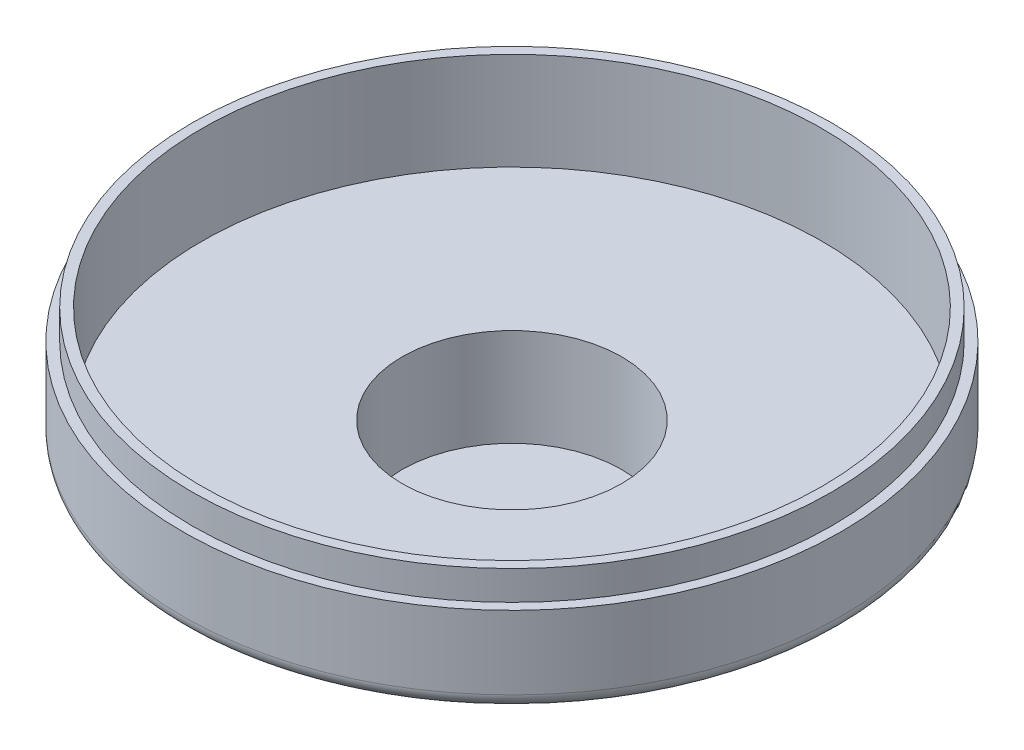
ISO-10303-21;
HEADER;
FILE_DESCRIPTION(('STEP AP214'),'2;1');
FILE_NAME('part.step','',(''),(''),'','','');
FILE_SCHEMA(('AUTOMOTIVE_DESIGN { 1 0 10303 214 1 1 1 1 }'));
ENDSEC;
DATA;
#1=APPLICATION_CONTEXT('core data for automotive mechanical design processes');
#2=APPLICATION_PROTOCOL_DEFINITION('international standard','automotive_design',2000,#1);
#3=PRODUCT_CONTEXT('',#1,'mechanical');
#4=PRODUCT('Part','Part','',(#3));
#5=PRODUCT_RELATED_PRODUCT_CATEGORY('part','',(#4));
#6=PRODUCT_DEFINITION_FORMATION('','',#4);
#7=PRODUCT_DEFINITION_CONTEXT('part definition',#1,'design');
#8=PRODUCT_DEFINITION('design','',#6,#7);
#9=PRODUCT_DEFINITION_SHAPE('','',#8);
#10=(LENGTH_UNIT() NAMED_UNIT(*) SI_UNIT(.MILLI.,.METRE.));
#11=(NAMED_UNIT(*) PLANE_ANGLE_UNIT() SI_UNIT($,.RADIAN.));
#12=(NAMED_UNIT(*) SI_UNIT($,.STERADIAN.) SOLID_ANGLE_UNIT());
#13=UNCERTAINTY_MEASURE_WITH_UNIT(LENGTH_MEASURE(1.E-05),#10,'distance_accuracy_value','');
#14=(GEOMETRIC_REPRESENTATION_CONTEXT(3) GLOBAL_UNCERTAINTY_ASSIGNED_CONTEXT((#13)) GLOBAL_UNIT_ASSIGNED_CONTEXT((#10,
#11,#12)) REPRESENTATION_CONTEXT('',''));
#15=CARTESIAN_POINT('',(0.,0.,0.));
#16=DIRECTION('',(0.,0.,1.));
#17=DIRECTION('',(1.,0.,0.));
#18=AXIS2_PLACEMENT_3D('',#15,#16,#17);
#19=CARTESIAN_POINT('',(33.75,0.,0.));
#20=DIRECTION('',(0.,1.,0.));
#21=DIRECTION('',(-1.,0.,0.));
#22=AXIS2_PLACEMENT_3D('',#19,#20,#21);
#23=PLANE('',#22);
#24=CARTESIAN_POINT('',(0.,0.,0.));
#25=DIRECTION('',(0.,-1.,0.));
#26=DIRECTION('',(1.,0.,0.));
#27=AXIS2_PLACEMENT_3D('',#24,#25,#26);
#28=CIRCLE('',#27,32.75);
#29=CARTESIAN_POINT('',(32.75,0.,0.));
#30=VERTEX_POINT('',#29);
#31=EDGE_CURVE('E94',#30,#30,#28,.T.);
#32=ORIENTED_EDGE('',*,*,#31,.T.);
#33=EDGE_LOOP('',(#32));
#34=FACE_BOUND('',#33,.T.);
#35=CARTESIAN_POINT('',(0.,0.,0.));
#36=DIRECTION('',(0.,-1.,0.));
#37=DIRECTION('',(1.,0.,0.));
#38=AXIS2_PLACEMENT_3D('',#35,#36,#37);
#39=CIRCLE('',#38,33.75);
#40=CARTESIAN_POINT('',(33.75,0.,0.));
#41=VERTEX_POINT('',#40);
#42=EDGE_CURVE('E66',#41,#41,#39,.T.);
#43=ORIENTED_EDGE('',*,*,#42,.F.);
#44=EDGE_LOOP('',(#43));
#45=FACE_BOUND('',#44,.T.);
#46=ADVANCED_FACE('F42',(#34,#45),#23,.T.);
#47=CARTESIAN_POINT('',(0.,-19.,0.));
#48=DIRECTION('',(0.,-1.,0.));
#49=DIRECTION('',(1.,0.,0.));
#50=AXIS2_PLACEMENT_3D('',#47,#48,#49);
#51=CYLINDRICAL_SURFACE('',#50,33.75);
#52=CARTESIAN_POINT('',(0.,-7.5,0.));
#53=DIRECTION('',(0.,-1.,0.));
#54=DIRECTION('',(1.,0.,0.));
#55=AXIS2_PLACEMENT_3D('',#52,#53,#54);
#56=CIRCLE('',#55,33.75);
#57=CARTESIAN_POINT('',(33.75,-7.5,0.));
#58=VERTEX_POINT('',#57);
#59=EDGE_CURVE('E10',#58,#58,#56,.F.);
#60=ORIENTED_EDGE('',*,*,#59,.T.);
#61=EDGE_LOOP('',(#60));
#62=FACE_BOUND('',#61,.T.);
#63=ORIENTED_EDGE('',*,*,#42,.T.);
#64=EDGE_LOOP('',(#63));
#65=FACE_BOUND('',#64,.T.);
#66=ADVANCED_FACE('F116',(#62,#65),#51,.T.);
#67=CARTESIAN_POINT('',(33.75,-9.,0.));
#68=DIRECTION('',(0.,-1.,0.));
#69=DIRECTION('',(1.,0.,0.));
#70=AXIS2_PLACEMENT_3D('',#67,#68,#69);
#71=PLANE('',#70);
#72=CARTESIAN_POINT('',(0.,-9.,0.));
#73=DIRECTION('',(0.,-1.,0.));
#74=DIRECTION('',(1.,0.,0.));
#75=AXIS2_PLACEMENT_3D('',#72,#73,#74);
#76=CIRCLE('',#75,32.25);
#77=CARTESIAN_POINT('',(32.25,-9.,0.));
#78=VERTEX_POINT('',#77);
#79=EDGE_CURVE('E50',#78,#78,#76,.T.);
#80=ORIENTED_EDGE('',*,*,#79,.T.);
#81=EDGE_LOOP('',(#80));
#82=FACE_BOUND('',#81,.T.);
#83=CARTESIAN_POINT('',(0.,-9.,0.));
#84=DIRECTION('',(0.,-1.,0.));
#85=DIRECTION('',(1.,0.,0.));
#86=AXIS2_PLACEMENT_3D('',#83,#84,#85);
#87=CIRCLE('',#86,13.25);
#88=CARTESIAN_POINT('',(13.25,-9.,0.));
#89=VERTEX_POINT('',#88);
#90=EDGE_CURVE('E70',#89,#89,#87,.T.);
#91=ORIENTED_EDGE('',*,*,#90,.F.);
#92=EDGE_LOOP('',(#91));
#93=FACE_BOUND('',#92,.T.);
#94=ADVANCED_FACE('F122',(#82,#93),#71,.T.);
#95=CARTESIAN_POINT('',(0.,-19.,0.));
#96=DIRECTION('',(0.,-1.,0.));
#97=DIRECTION('',(1.,0.,0.));
#98=AXIS2_PLACEMENT_3D('',#95,#96,#97);
#99=CYLINDRICAL_SURFACE('',#98,13.25);
#100=CARTESIAN_POINT('',(0.,-17.5,0.));
#101=DIRECTION('',(0.,-1.,0.));
#102=DIRECTION('',(1.,0.,0.));
#103=AXIS2_PLACEMENT_3D('',#100,#101,#102);
#104=CIRCLE('',#103,13.25);
#105=CARTESIAN_POINT('',(13.25,-17.5,0.));
#106=VERTEX_POINT('',#105);
#107=EDGE_CURVE('E55',#106,#106,#104,.F.);
#108=ORIENTED_EDGE('',*,*,#107,.T.);
#109=EDGE_LOOP('',(#108));
#110=FACE_BOUND('',#109,.T.);
#111=ORIENTED_EDGE('',*,*,#90,.T.);
#112=EDGE_LOOP('',(#111));
#113=FACE_BOUND('',#112,.T.);
#114=ADVANCED_FACE('F127',(#110,#113),#99,.T.);
#115=CARTESIAN_POINT('',(13.25,-19.,0.));
#116=DIRECTION('',(0.,-1.,0.));
#117=DIRECTION('',(1.,0.,0.));
#118=AXIS2_PLACEMENT_3D('',#115,#116,#117);
#119=PLANE('',#118);
#120=CARTESIAN_POINT('',(0.,-19.,0.));
#121=DIRECTION('',(0.,-1.,0.));
#122=DIRECTION('',(1.,0.,0.));
#123=AXIS2_PLACEMENT_3D('',#120,#121,#122);
#124=CIRCLE('',#123,11.75);
#125=CARTESIAN_POINT('',(11.75,-19.,0.));
#126=VERTEX_POINT('',#125);
#127=EDGE_CURVE('E60',#126,#126,#124,.T.);
#128=ORIENTED_EDGE('',*,*,#127,.T.);
#129=EDGE_LOOP('',(#128));
#130=FACE_BOUND('',#129,.T.);
#131=ADVANCED_FACE('F130',(#130),#119,.T.);
#132=CARTESIAN_POINT('',(11.25,-17.,0.));
#133=DIRECTION('',(0.,1.,0.));
#134=DIRECTION('',(-1.,0.,0.));
#135=AXIS2_PLACEMENT_3D('',#132,#133,#134);
#136=PLANE('',#135);
#137=CARTESIAN_POINT('',(0.,-17.,0.));
#138=DIRECTION('',(0.,-1.,0.));
#139=DIRECTION('',(1.,0.,0.));
#140=AXIS2_PLACEMENT_3D('',#137,#138,#139);
#141=CIRCLE('',#140,11.25);
#142=CARTESIAN_POINT('',(11.25,-17.,0.));
#143=VERTEX_POINT('',#142);
#144=EDGE_CURVE('E74',#143,#143,#141,.T.);
#145=ORIENTED_EDGE('',*,*,#144,.F.);
#146=EDGE_LOOP('',(#145));
#147=FACE_BOUND('',#146,.T.);
#148=ADVANCED_FACE('F134',(#147),#136,.T.);
#149=CARTESIAN_POINT('',(0.,-19.,0.));
#150=DIRECTION('',(0.,-1.,0.));
#151=DIRECTION('',(1.,0.,0.));
#152=AXIS2_PLACEMENT_3D('',#149,#150,#151);
#153=CYLINDRICAL_SURFACE('',#152,11.25);
#154=ORIENTED_EDGE('',*,*,#144,.T.);
#155=EDGE_LOOP('',(#154));
#156=FACE_BOUND('',#155,.T.);
#157=CARTESIAN_POINT('',(0.,-7.,0.));
#158=DIRECTION('',(0.,-1.,0.));
#159=DIRECTION('',(1.,0.,0.));
#160=AXIS2_PLACEMENT_3D('',#157,#158,#159);
#161=CIRCLE('',#160,11.25);
#162=CARTESIAN_POINT('',(11.25,-7.,0.));
#163=VERTEX_POINT('',#162);
#164=EDGE_CURVE('E78',#163,#163,#161,.T.);
#165=ORIENTED_EDGE('',*,*,#164,.F.);
#166=EDGE_LOOP('',(#165));
#167=FACE_BOUND('',#166,.T.);
#168=ADVANCED_FACE('F138',(#156,#167),#153,.F.);
#169=CARTESIAN_POINT('',(31.75,-7.,0.));
#170=DIRECTION('',(0.,1.,0.));
#171=DIRECTION('',(-1.,0.,0.));
#172=AXIS2_PLACEMENT_3D('',#169,#170,#171);
#173=PLANE('',#172);
#174=ORIENTED_EDGE('',*,*,#164,.T.);
#175=EDGE_LOOP('',(#174));
#176=FACE_BOUND('',#175,.T.);
#177=CARTESIAN_POINT('',(0.,-7.,0.));
#178=DIRECTION('',(0.,-1.,0.));
#179=DIRECTION('',(1.,0.,0.));
#180=AXIS2_PLACEMENT_3D('',#177,#178,#179);
#181=CIRCLE('',#180,31.75);
#182=CARTESIAN_POINT('',(31.75,-7.,0.));
#183=VERTEX_POINT('',#182);
#184=EDGE_CURVE('E82',#183,#183,#181,.T.);
#185=ORIENTED_EDGE('',*,*,#184,.F.);
#186=EDGE_LOOP('',(#185));
#187=FACE_BOUND('',#186,.T.);
#188=ADVANCED_FACE('F142',(#176,#187),#173,.T.);
#189=CARTESIAN_POINT('',(0.,-19.,0.));
#190=DIRECTION('',(0.,-1.,0.));
#191=DIRECTION('',(1.,0.,0.));
#192=AXIS2_PLACEMENT_3D('',#189,#190,#191);
#193=CYLINDRICAL_SURFACE('',#192,31.75);
#194=ORIENTED_EDGE('',*,*,#184,.T.);
#195=EDGE_LOOP('',(#194));
#196=FACE_BOUND('',#195,.T.);
#197=CARTESIAN_POINT('',(0.,3.,0.));
#198=DIRECTION('',(0.,-1.,0.));
#199=DIRECTION('',(1.,0.,0.));
#200=AXIS2_PLACEMENT_3D('',#197,#198,#199);
#201=CIRCLE('',#200,31.75);
#202=CARTESIAN_POINT('',(31.75,3.,0.));
#203=VERTEX_POINT('',#202);
#204=EDGE_CURVE('E86',#203,#203,#201,.T.);
#205=ORIENTED_EDGE('',*,*,#204,.F.);
#206=EDGE_LOOP('',(#205));
#207=FACE_BOUND('',#206,.T.);
#208=ADVANCED_FACE('F112',(#196,#207),#193,.F.);
#209=CARTESIAN_POINT('',(32.75,3.,0.));
#210=DIRECTION('',(0.,1.,0.));
#211=DIRECTION('',(-1.,0.,0.));
#212=AXIS2_PLACEMENT_3D('',#209,#210,#211);
#213=PLANE('',#212);
#214=ORIENTED_EDGE('',*,*,#204,.T.);
#215=EDGE_LOOP('',(#214));
#216=FACE_BOUND('',#215,.T.);
#217=CARTESIAN_POINT('',(0.,3.,0.));
#218=DIRECTION('',(0.,-1.,0.));
#219=DIRECTION('',(1.,0.,0.));
#220=AXIS2_PLACEMENT_3D('',#217,#218,#219);
#221=CIRCLE('',#220,32.75);
#222=CARTESIAN_POINT('',(32.75,3.,0.));
#223=VERTEX_POINT('',#222);
#224=EDGE_CURVE('E90',#223,#223,#221,.T.);
#225=ORIENTED_EDGE('',*,*,#224,.F.);
#226=EDGE_LOOP('',(#225));
#227=FACE_BOUND('',#226,.T.);
#228=ADVANCED_FACE('F104',(#216,#227),#213,.T.);
#229=CARTESIAN_POINT('',(0.,-19.,0.));
#230=DIRECTION('',(0.,-1.,0.));
#231=DIRECTION('',(1.,0.,0.));
#232=AXIS2_PLACEMENT_3D('',#229,#230,#231);
#233=CYLINDRICAL_SURFACE('',#232,32.75);
#234=ORIENTED_EDGE('',*,*,#224,.T.);
#235=EDGE_LOOP('',(#234));
#236=FACE_BOUND('',#235,.T.);
#237=ORIENTED_EDGE('',*,*,#31,.F.);
#238=EDGE_LOOP('',(#237));
#239=FACE_BOUND('',#238,.T.);
#240=ADVANCED_FACE('F101',(#236,#239),#233,.T.);
#241=CARTESIAN_POINT('',(0.,-17.5,0.));
#242=DIRECTION('',(0.,-1.,0.));
#243=DIRECTION('',(1.,0.,0.));
#244=AXIS2_PLACEMENT_3D('',#241,#242,#243);
#245=TOROIDAL_SURFACE('',#244,11.75,1.5);
#246=ORIENTED_EDGE('',*,*,#107,.F.);
#247=EDGE_LOOP('',(#246));
#248=FACE_BOUND('',#247,.T.);
#249=ORIENTED_EDGE('',*,*,#127,.F.);
#250=EDGE_LOOP('',(#249));
#251=FACE_BOUND('',#250,.T.);
#252=ADVANCED_FACE('F103',(#248,#251),#245,.T.);
#253=CARTESIAN_POINT('',(0.,-7.5,0.));
#254=DIRECTION('',(0.,-1.,0.));
#255=DIRECTION('',(1.,0.,0.));
#256=AXIS2_PLACEMENT_3D('',#253,#254,#255);
#257=TOROIDAL_SURFACE('',#256,32.25,1.5);
#258=ORIENTED_EDGE('',*,*,#59,.F.);
#259=EDGE_LOOP('',(#258));
#260=FACE_BOUND('',#259,.T.);
#261=ORIENTED_EDGE('',*,*,#79,.F.);
#262=EDGE_LOOP('',(#261));
#263=FACE_BOUND('',#262,.T.);
#264=ADVANCED_FACE('F44',(#260,#263),#257,.T.);
#265=CLOSED_SHELL('',(#46,#66,#94,#114,#131,#148,#168,#188,#208,#228,#240,#252,#264));
#266=MANIFOLD_SOLID_BREP('B2',#265);
#267=ADVANCED_BREP_SHAPE_REPRESENTATION('',(#18,#266),#14);
#268=SHAPE_DEFINITION_REPRESENTATION(#9,#267);
ENDSEC;
END-ISO-10303-21;
